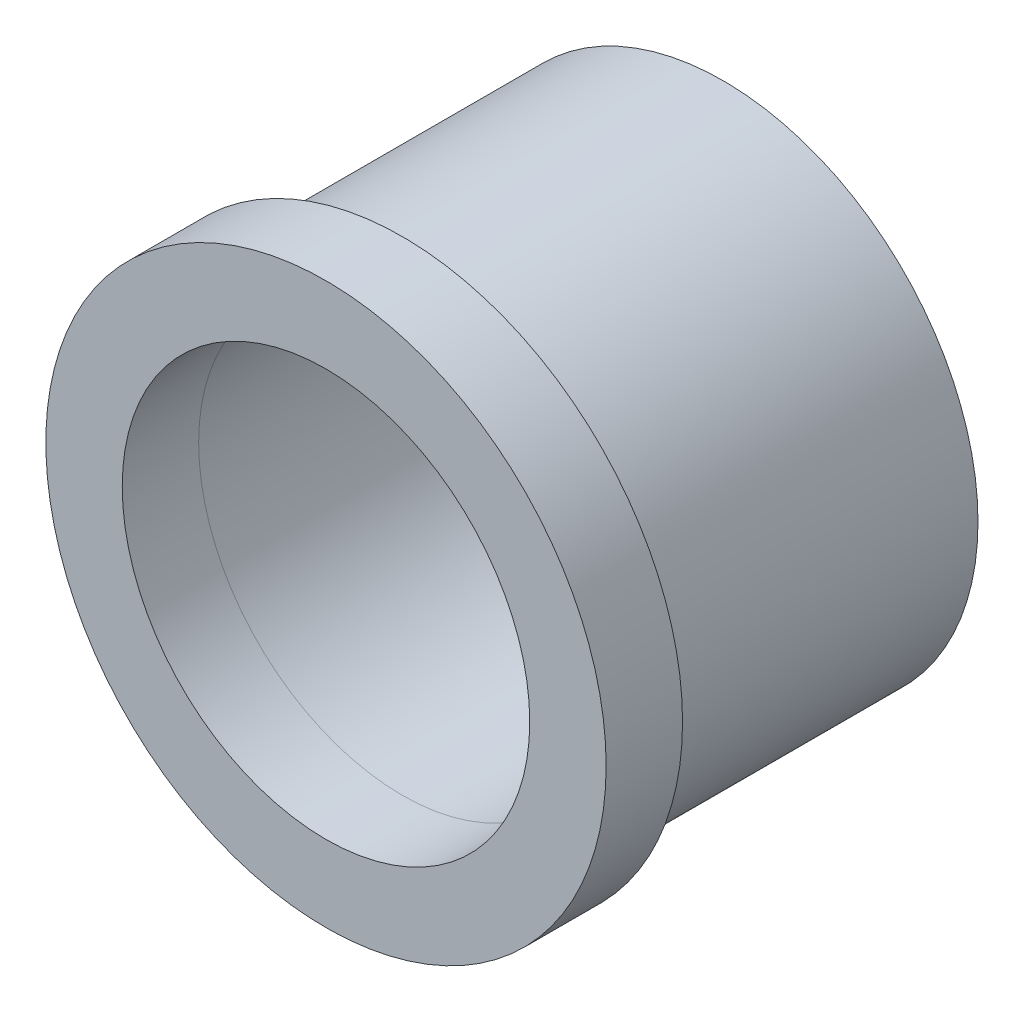
ISO-10303-21;
HEADER;
FILE_DESCRIPTION(('STEP AP214'),'2;1');
FILE_NAME('part.step','',(''),(''),'','','');
FILE_SCHEMA(('AUTOMOTIVE_DESIGN { 1 0 10303 214 1 1 1 1 }'));
ENDSEC;
DATA;
#1=APPLICATION_CONTEXT('core data for automotive mechanical design processes');
#2=APPLICATION_PROTOCOL_DEFINITION('international standard','automotive_design',2000,#1);
#3=PRODUCT_CONTEXT('',#1,'mechanical');
#4=PRODUCT('Part','Part','',(#3));
#5=PRODUCT_RELATED_PRODUCT_CATEGORY('part','',(#4));
#6=PRODUCT_DEFINITION_FORMATION('','',#4);
#7=PRODUCT_DEFINITION_CONTEXT('part definition',#1,'design');
#8=PRODUCT_DEFINITION('design','',#6,#7);
#9=PRODUCT_DEFINITION_SHAPE('','',#8);
#10=(LENGTH_UNIT() NAMED_UNIT(*) SI_UNIT(.MILLI.,.METRE.));
#11=(NAMED_UNIT(*) PLANE_ANGLE_UNIT() SI_UNIT($,.RADIAN.));
#12=(NAMED_UNIT(*) SI_UNIT($,.STERADIAN.) SOLID_ANGLE_UNIT());
#13=UNCERTAINTY_MEASURE_WITH_UNIT(LENGTH_MEASURE(1.E-05),#10,'distance_accuracy_value','');
#14=(GEOMETRIC_REPRESENTATION_CONTEXT(3) GLOBAL_UNCERTAINTY_ASSIGNED_CONTEXT((#13)) GLOBAL_UNIT_ASSIGNED_CONTEXT((#10,
#11,#12)) REPRESENTATION_CONTEXT('',''));
#15=CARTESIAN_POINT('',(0.,0.,0.));
#16=DIRECTION('',(0.,0.,1.));
#17=DIRECTION('',(1.,0.,0.));
#18=AXIS2_PLACEMENT_3D('',#15,#16,#17);
#19=CARTESIAN_POINT('',(0.,0.,7.8));
#20=DIRECTION('',(0.,0.,1.));
#21=DIRECTION('',(1.,0.,0.));
#22=AXIS2_PLACEMENT_3D('',#19,#20,#21);
#23=PLANE('',#22);
#24=CARTESIAN_POINT('',(0.,0.,7.8));
#25=DIRECTION('',(0.,0.,1.));
#26=DIRECTION('',(1.,0.,0.));
#27=AXIS2_PLACEMENT_3D('',#24,#25,#26);
#28=CIRCLE('',#27,5.5);
#29=CARTESIAN_POINT('',(5.5,0.,7.8));
#30=VERTEX_POINT('',#29);
#31=EDGE_CURVE('E11',#30,#30,#28,.T.);
#32=ORIENTED_EDGE('',*,*,#31,.T.);
#33=EDGE_LOOP('',(#32));
#34=FACE_BOUND('',#33,.T.);
#35=CARTESIAN_POINT('',(0.,0.,7.8));
#36=DIRECTION('',(0.,0.,1.));
#37=DIRECTION('',(1.,0.,0.));
#38=AXIS2_PLACEMENT_3D('',#35,#36,#37);
#39=CIRCLE('',#38,4.);
#40=CARTESIAN_POINT('',(4.,0.,7.8));
#41=VERTEX_POINT('',#40);
#42=EDGE_CURVE('E56',#41,#41,#39,.T.);
#43=ORIENTED_EDGE('',*,*,#42,.F.);
#44=EDGE_LOOP('',(#43));
#45=FACE_BOUND('',#44,.T.);
#46=ADVANCED_FACE('F45',(#34,#45),#23,.T.);
#47=CARTESIAN_POINT('',(0.,0.,6.3));
#48=DIRECTION('',(0.,0.,1.));
#49=DIRECTION('',(1.,0.,0.));
#50=AXIS2_PLACEMENT_3D('',#47,#48,#49);
#51=PLANE('',#50);
#52=CARTESIAN_POINT('',(0.,0.,6.3));
#53=DIRECTION('',(0.,0.,1.));
#54=DIRECTION('',(1.,0.,0.));
#55=AXIS2_PLACEMENT_3D('',#52,#53,#54);
#56=CIRCLE('',#55,5.5);
#57=CARTESIAN_POINT('',(5.5,0.,6.3));
#58=VERTEX_POINT('',#57);
#59=EDGE_CURVE('E49',#58,#58,#56,.T.);
#60=ORIENTED_EDGE('',*,*,#59,.F.);
#61=EDGE_LOOP('',(#60));
#62=FACE_BOUND('',#61,.T.);
#63=CARTESIAN_POINT('',(0.,0.,6.3));
#64=DIRECTION('',(0.,0.,1.));
#65=DIRECTION('',(1.,0.,0.));
#66=AXIS2_PLACEMENT_3D('',#63,#64,#65);
#67=CIRCLE('',#66,4.);
#68=CARTESIAN_POINT('',(4.,0.,6.3));
#69=VERTEX_POINT('',#68);
#70=EDGE_CURVE('E58',#69,#69,#67,.T.);
#71=ORIENTED_EDGE('',*,*,#70,.T.);
#72=EDGE_LOOP('',(#71));
#73=FACE_BOUND('',#72,.T.);
#74=ADVANCED_FACE('F68',(#62,#73),#51,.F.);
#75=CARTESIAN_POINT('',(0.,0.,7.8));
#76=DIRECTION('',(0.,0.,-1.));
#77=DIRECTION('',(-1.,0.,0.));
#78=AXIS2_PLACEMENT_3D('',#75,#76,#77);
#79=CYLINDRICAL_SURFACE('',#78,5.5);
#80=ORIENTED_EDGE('',*,*,#31,.F.);
#81=EDGE_LOOP('',(#80));
#82=FACE_BOUND('',#81,.T.);
#83=ORIENTED_EDGE('',*,*,#59,.T.);
#84=EDGE_LOOP('',(#83));
#85=FACE_BOUND('',#84,.T.);
#86=ADVANCED_FACE('F47',(#82,#85),#79,.T.);
#87=CARTESIAN_POINT('',(0.,0.,7.8));
#88=DIRECTION('',(0.,0.,-1.));
#89=DIRECTION('',(-1.,0.,0.));
#90=AXIS2_PLACEMENT_3D('',#87,#88,#89);
#91=CYLINDRICAL_SURFACE('',#90,4.);
#92=ORIENTED_EDGE('',*,*,#42,.T.);
#93=EDGE_LOOP('',(#92));
#94=FACE_BOUND('',#93,.T.);
#95=ORIENTED_EDGE('',*,*,#70,.F.);
#96=EDGE_LOOP('',(#95));
#97=FACE_BOUND('',#96,.T.);
#98=ADVANCED_FACE('F64',(#94,#97),#91,.F.);
#99=CLOSED_SHELL('',(#46,#74,#86,#98));
#100=MANIFOLD_SOLID_BREP('B2',#99);
#101=CARTESIAN_POINT('',(0.,0.,6.3));
#102=DIRECTION('',(0.,0.,1.));
#103=DIRECTION('',(1.,0.,0.));
#104=AXIS2_PLACEMENT_3D('',#101,#102,#103);
#105=PLANE('',#104);
#106=CARTESIAN_POINT('',(0.,0.,6.3));
#107=DIRECTION('',(0.,0.,1.));
#108=DIRECTION('',(1.,0.,0.));
#109=AXIS2_PLACEMENT_3D('',#106,#107,#108);
#110=CIRCLE('',#109,5.);
#111=CARTESIAN_POINT('',(5.,0.,6.3));
#112=VERTEX_POINT('',#111);
#113=EDGE_CURVE('E44',#112,#112,#110,.T.);
#114=ORIENTED_EDGE('',*,*,#113,.T.);
#115=EDGE_LOOP('',(#114));
#116=FACE_BOUND('',#115,.T.);
#117=CARTESIAN_POINT('',(0.,0.,6.3));
#118=DIRECTION('',(0.,0.,1.));
#119=DIRECTION('',(1.,0.,0.));
#120=AXIS2_PLACEMENT_3D('',#117,#118,#119);
#121=CIRCLE('',#120,4.);
#122=CARTESIAN_POINT('',(4.,0.,6.3));
#123=VERTEX_POINT('',#122);
#124=EDGE_CURVE('E118',#123,#123,#121,.T.);
#125=ORIENTED_EDGE('',*,*,#124,.F.);
#126=EDGE_LOOP('',(#125));
#127=FACE_BOUND('',#126,.T.);
#128=ADVANCED_FACE('F107',(#116,#127),#105,.T.);
#129=CARTESIAN_POINT('',(0.,0.,0.));
#130=DIRECTION('',(0.,0.,1.));
#131=DIRECTION('',(1.,0.,0.));
#132=AXIS2_PLACEMENT_3D('',#129,#130,#131);
#133=PLANE('',#132);
#134=CARTESIAN_POINT('',(0.,0.,0.));
#135=DIRECTION('',(0.,0.,1.));
#136=DIRECTION('',(1.,0.,0.));
#137=AXIS2_PLACEMENT_3D('',#134,#135,#136);
#138=CIRCLE('',#137,5.);
#139=CARTESIAN_POINT('',(5.,0.,0.));
#140=VERTEX_POINT('',#139);
#141=EDGE_CURVE('E111',#140,#140,#138,.T.);
#142=ORIENTED_EDGE('',*,*,#141,.F.);
#143=EDGE_LOOP('',(#142));
#144=FACE_BOUND('',#143,.T.);
#145=CARTESIAN_POINT('',(0.,0.,0.));
#146=DIRECTION('',(0.,0.,1.));
#147=DIRECTION('',(1.,0.,0.));
#148=AXIS2_PLACEMENT_3D('',#145,#146,#147);
#149=CIRCLE('',#148,4.);
#150=CARTESIAN_POINT('',(4.,0.,0.));
#151=VERTEX_POINT('',#150);
#152=EDGE_CURVE('E120',#151,#151,#149,.T.);
#153=ORIENTED_EDGE('',*,*,#152,.T.);
#154=EDGE_LOOP('',(#153));
#155=FACE_BOUND('',#154,.T.);
#156=ADVANCED_FACE('F130',(#144,#155),#133,.F.);
#157=CARTESIAN_POINT('',(0.,0.,6.3));
#158=DIRECTION('',(0.,0.,-1.));
#159=DIRECTION('',(-1.,0.,0.));
#160=AXIS2_PLACEMENT_3D('',#157,#158,#159);
#161=CYLINDRICAL_SURFACE('',#160,5.);
#162=ORIENTED_EDGE('',*,*,#113,.F.);
#163=EDGE_LOOP('',(#162));
#164=FACE_BOUND('',#163,.T.);
#165=ORIENTED_EDGE('',*,*,#141,.T.);
#166=EDGE_LOOP('',(#165));
#167=FACE_BOUND('',#166,.T.);
#168=ADVANCED_FACE('F109',(#164,#167),#161,.T.);
#169=CARTESIAN_POINT('',(0.,0.,6.3));
#170=DIRECTION('',(0.,0.,-1.));
#171=DIRECTION('',(-1.,0.,0.));
#172=AXIS2_PLACEMENT_3D('',#169,#170,#171);
#173=CYLINDRICAL_SURFACE('',#172,4.);
#174=ORIENTED_EDGE('',*,*,#124,.T.);
#175=EDGE_LOOP('',(#174));
#176=FACE_BOUND('',#175,.T.);
#177=ORIENTED_EDGE('',*,*,#152,.F.);
#178=EDGE_LOOP('',(#177));
#179=FACE_BOUND('',#178,.T.);
#180=ADVANCED_FACE('F126',(#176,#179),#173,.F.);
#181=CLOSED_SHELL('',(#128,#156,#168,#180));
#182=MANIFOLD_SOLID_BREP('B6',#181);
#183=ADVANCED_BREP_SHAPE_REPRESENTATION('',(#18,#100,#182),#14);
#184=SHAPE_DEFINITION_REPRESENTATION(#9,#183);
ENDSEC;
END-ISO-10303-21;
